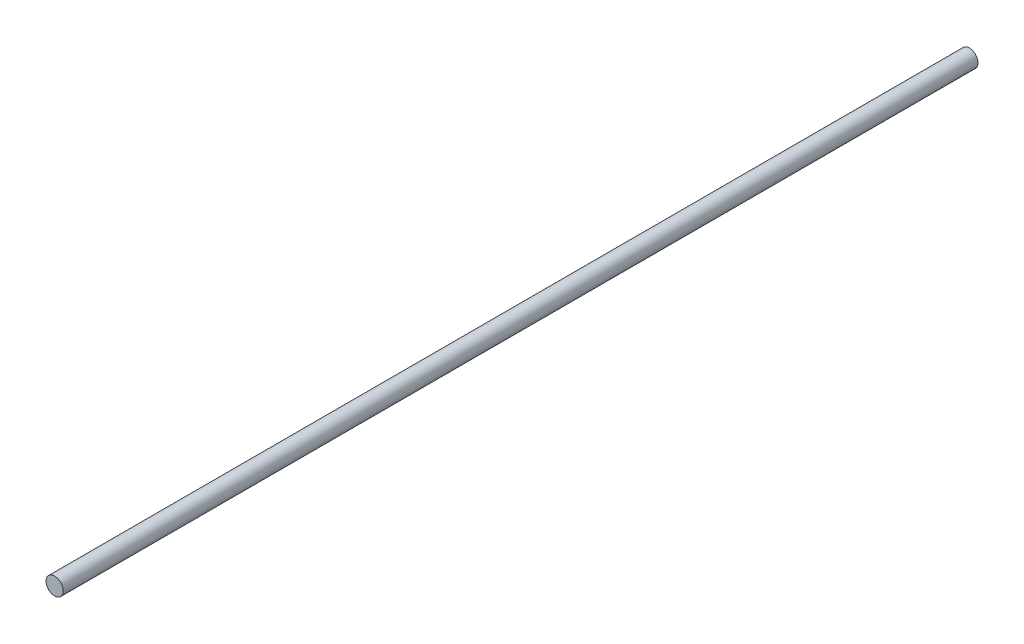
ISO-10303-21;
HEADER;
FILE_DESCRIPTION(('STEP AP214'),'2;1');
FILE_NAME('part.step','',(''),(''),'','','');
FILE_SCHEMA(('AUTOMOTIVE_DESIGN { 1 0 10303 214 1 1 1 1 }'));
ENDSEC;
DATA;
#1=APPLICATION_CONTEXT('core data for automotive mechanical design processes');
#2=APPLICATION_PROTOCOL_DEFINITION('international standard','automotive_design',2000,#1);
#3=PRODUCT_CONTEXT('',#1,'mechanical');
#4=PRODUCT('Part','Part','',(#3));
#5=PRODUCT_RELATED_PRODUCT_CATEGORY('part','',(#4));
#6=PRODUCT_DEFINITION_FORMATION('','',#4);
#7=PRODUCT_DEFINITION_CONTEXT('part definition',#1,'design');
#8=PRODUCT_DEFINITION('design','',#6,#7);
#9=PRODUCT_DEFINITION_SHAPE('','',#8);
#10=(LENGTH_UNIT() NAMED_UNIT(*) SI_UNIT(.MILLI.,.METRE.));
#11=(NAMED_UNIT(*) PLANE_ANGLE_UNIT() SI_UNIT($,.RADIAN.));
#12=(NAMED_UNIT(*) SI_UNIT($,.STERADIAN.) SOLID_ANGLE_UNIT());
#13=UNCERTAINTY_MEASURE_WITH_UNIT(LENGTH_MEASURE(1.E-05),#10,'distance_accuracy_value','');
#14=(GEOMETRIC_REPRESENTATION_CONTEXT(3) GLOBAL_UNCERTAINTY_ASSIGNED_CONTEXT((#13)) GLOBAL_UNIT_ASSIGNED_CONTEXT((#10,
#11,#12)) REPRESENTATION_CONTEXT('',''));
#15=CARTESIAN_POINT('',(0.,0.,0.));
#16=DIRECTION('',(0.,0.,1.));
#17=DIRECTION('',(1.,0.,0.));
#18=AXIS2_PLACEMENT_3D('',#15,#16,#17);
#19=CARTESIAN_POINT('',(0.,0.,-150.));
#20=DIRECTION('',(0.,0.,1.));
#21=DIRECTION('',(1.,0.,0.));
#22=AXIS2_PLACEMENT_3D('',#19,#20,#21);
#23=CYLINDRICAL_SURFACE('',#22,4.);
#24=CARTESIAN_POINT('',(0.,0.,-150.));
#25=DIRECTION('',(0.,0.,1.));
#26=DIRECTION('',(1.,0.,0.));
#27=AXIS2_PLACEMENT_3D('',#24,#25,#26);
#28=CIRCLE('',#27,4.);
#29=CARTESIAN_POINT('',(4.,0.,-150.));
#30=VERTEX_POINT('',#29);
#31=EDGE_CURVE('E10',#30,#30,#28,.T.);
#32=ORIENTED_EDGE('',*,*,#31,.T.);
#33=EDGE_LOOP('',(#32));
#34=FACE_BOUND('',#33,.T.);
#35=CARTESIAN_POINT('',(0.,0.,275.));
#36=DIRECTION('',(0.,0.,1.));
#37=DIRECTION('',(1.,0.,0.));
#38=AXIS2_PLACEMENT_3D('',#35,#36,#37);
#39=CIRCLE('',#38,4.);
#40=CARTESIAN_POINT('',(4.,0.,275.));
#41=VERTEX_POINT('',#40);
#42=EDGE_CURVE('E37',#41,#41,#39,.T.);
#43=ORIENTED_EDGE('',*,*,#42,.F.);
#44=EDGE_LOOP('',(#43));
#45=FACE_BOUND('',#44,.T.);
#46=ADVANCED_FACE('F31',(#34,#45),#23,.T.);
#47=CARTESIAN_POINT('',(0.,0.,-150.));
#48=DIRECTION('',(0.,0.,1.));
#49=DIRECTION('',(1.,0.,0.));
#50=AXIS2_PLACEMENT_3D('',#47,#48,#49);
#51=PLANE('',#50);
#52=ORIENTED_EDGE('',*,*,#31,.F.);
#53=EDGE_LOOP('',(#52));
#54=FACE_BOUND('',#53,.T.);
#55=ADVANCED_FACE('F46',(#54),#51,.F.);
#56=CARTESIAN_POINT('',(0.,0.,275.));
#57=DIRECTION('',(0.,0.,1.));
#58=DIRECTION('',(1.,0.,0.));
#59=AXIS2_PLACEMENT_3D('',#56,#57,#58);
#60=PLANE('',#59);
#61=ORIENTED_EDGE('',*,*,#42,.T.);
#62=EDGE_LOOP('',(#61));
#63=FACE_BOUND('',#62,.T.);
#64=ADVANCED_FACE('F43',(#63),#60,.T.);
#65=CLOSED_SHELL('',(#46,#55,#64));
#66=MANIFOLD_SOLID_BREP('B2',#65);
#67=ADVANCED_BREP_SHAPE_REPRESENTATION('',(#18,#66),#14);
#68=SHAPE_DEFINITION_REPRESENTATION(#9,#67);
ENDSEC;
END-ISO-10303-21;
